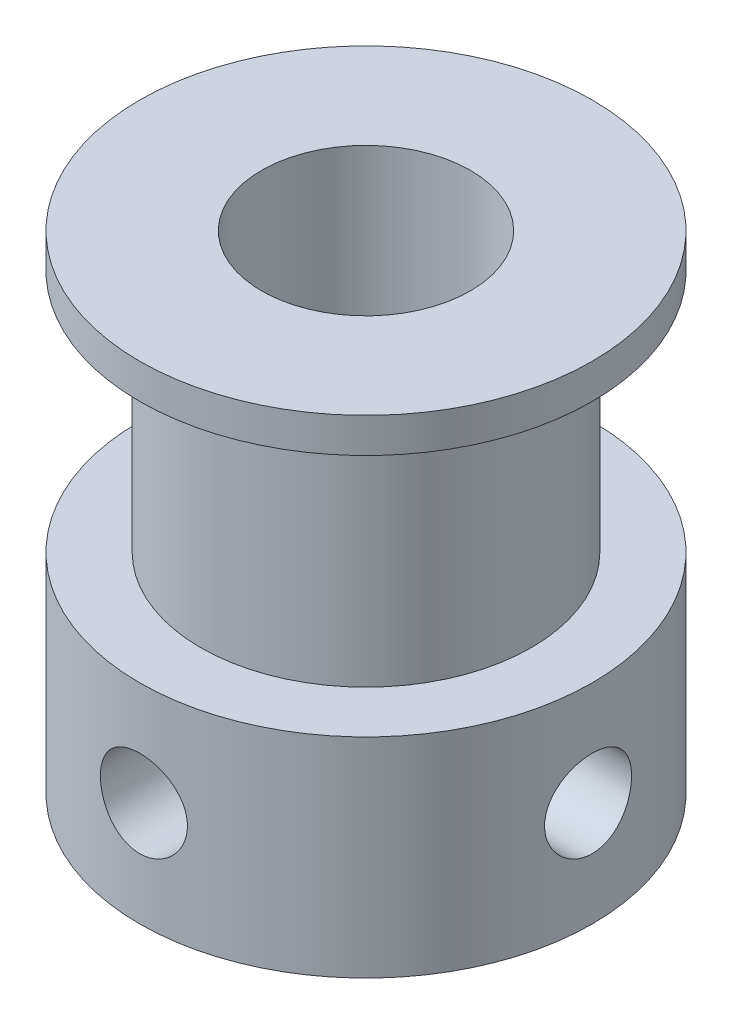
ISO-10303-21;
HEADER;
FILE_DESCRIPTION(('STEP AP214'),'2;1');
FILE_NAME('part.step','',(''),(''),'','','');
FILE_SCHEMA(('AUTOMOTIVE_DESIGN { 1 0 10303 214 1 1 1 1 }'));
ENDSEC;
DATA;
#1=APPLICATION_CONTEXT('core data for automotive mechanical design processes');
#2=APPLICATION_PROTOCOL_DEFINITION('international standard','automotive_design',2000,#1);
#3=PRODUCT_CONTEXT('',#1,'mechanical');
#4=PRODUCT('Part','Part','',(#3));
#5=PRODUCT_RELATED_PRODUCT_CATEGORY('part','',(#4));
#6=PRODUCT_DEFINITION_FORMATION('','',#4);
#7=PRODUCT_DEFINITION_CONTEXT('part definition',#1,'design');
#8=PRODUCT_DEFINITION('design','',#6,#7);
#9=PRODUCT_DEFINITION_SHAPE('','',#8);
#10=(LENGTH_UNIT() NAMED_UNIT(*) SI_UNIT(.MILLI.,.METRE.));
#11=(NAMED_UNIT(*) PLANE_ANGLE_UNIT() SI_UNIT($,.RADIAN.));
#12=(NAMED_UNIT(*) SI_UNIT($,.STERADIAN.) SOLID_ANGLE_UNIT());
#13=UNCERTAINTY_MEASURE_WITH_UNIT(LENGTH_MEASURE(1.E-05),#10,'distance_accuracy_value','');
#14=(GEOMETRIC_REPRESENTATION_CONTEXT(3) GLOBAL_UNCERTAINTY_ASSIGNED_CONTEXT((#13)) GLOBAL_UNIT_ASSIGNED_CONTEXT((#10,
#11,#12)) REPRESENTATION_CONTEXT('',''));
#15=CARTESIAN_POINT('',(0.,0.,0.));
#16=DIRECTION('',(0.,0.,1.));
#17=DIRECTION('',(1.,0.,0.));
#18=AXIS2_PLACEMENT_3D('',#15,#16,#17);
#19=CARTESIAN_POINT('',(0.,0.,0.));
#20=DIRECTION('',(0.,-1.,0.));
#21=DIRECTION('',(0.,0.,-1.));
#22=AXIS2_PLACEMENT_3D('',#19,#20,#21);
#23=CYLINDRICAL_SURFACE('',#22,3.);
#24=CARTESIAN_POINT('',(2.72717802865893,3.,1.24999999999999));
#25=CARTESIAN_POINT('',(2.72718519563219,3.06667189089685,1.24999259066567));
#26=CARTESIAN_POINT('',(2.729658595344,3.13345265682621,1.24463203881502));
#27=CARTESIAN_POINT('',(2.73923833650884,3.26508694205714,1.22339678947784));
#28=CARTESIAN_POINT('',(2.74635725824267,3.32993472667523,1.20749354003276));
#29=CARTESIAN_POINT('',(2.76426917574768,3.45556112969107,1.1658998841945));
#30=CARTESIAN_POINT('',(2.77504717562616,3.51635516371501,1.14024937431427));
#31=CARTESIAN_POINT('',(2.79904148565793,3.63275944957805,1.08000637754462));
#32=CARTESIAN_POINT('',(2.81225721880783,3.68837092343312,1.04541600591531));
#33=CARTESIAN_POINT('',(2.84055762619857,3.79632572497347,0.965973882676161));
#34=CARTESIAN_POINT('',(2.85570568079146,3.84830755874409,0.920653238184403));
#35=CARTESIAN_POINT('',(2.88564295372227,3.94420022249755,0.822021675745545));
#36=CARTESIAN_POINT('',(2.90043203180789,3.98810794061301,0.768707691374));
#37=CARTESIAN_POINT('',(2.92875537930613,4.06844953087927,0.652763393797344));
#38=CARTESIAN_POINT('',(2.94220739975291,4.10447662803234,0.589829293683655));
#39=CARTESIAN_POINT('',(2.96556519993426,4.1652760205056,0.45813202236235));
#40=CARTESIAN_POINT('',(2.97547255347157,4.19005331196421,0.389371454872121));
#41=CARTESIAN_POINT('',(2.99017521042367,4.22633945875673,0.251768498025164));
#42=CARTESIAN_POINT('',(2.99520971127466,4.23847169490204,0.183116576196079));
#43=CARTESIAN_POINT('',(3.00046828611204,4.25113764115985,0.0445791803650051));
#44=CARTESIAN_POINT('',(3.00069431131015,4.25167605588295,-0.0253057817645169));
#45=CARTESIAN_POINT('',(2.99645129133056,4.24146571906667,-0.159792780112568));
#46=CARTESIAN_POINT('',(2.99226714648664,4.23140189947427,-0.224457488607313));
#47=CARTESIAN_POINT('',(2.98006516750309,4.20144689736183,-0.351082893931455));
#48=CARTESIAN_POINT('',(2.97204705074577,4.18155499036983,-0.413043391054915));
#49=CARTESIAN_POINT('',(2.95279852414029,4.13227195910535,-0.533638118077524));
#50=CARTESIAN_POINT('',(2.94152097126085,4.10274053712917,-0.592207177074904));
#51=CARTESIAN_POINT('',(2.91685713989805,4.03515424329965,-0.703711767281961));
#52=CARTESIAN_POINT('',(2.90347011666255,3.99709635915501,-0.756645297756971));
#53=CARTESIAN_POINT('',(2.87481698777061,3.91041757959538,-0.85934091170792));
#54=CARTESIAN_POINT('',(2.8594849435601,3.86124120872099,-0.908616437316237));
#55=CARTESIAN_POINT('',(2.8293786068147,3.75528855929341,-0.998431414927664));
#56=CARTESIAN_POINT('',(2.8146045313137,3.6985093617079,-1.03896749582431));
#57=CARTESIAN_POINT('',(2.78681612355338,3.57660496333808,-1.11140189250063));
#58=CARTESIAN_POINT('',(2.77387558556714,3.51126679425672,-1.1429725335554));
#59=CARTESIAN_POINT('',(2.75209844221011,3.3755189550255,-1.19446432058391));
#60=CARTESIAN_POINT('',(2.74325890334594,3.30511295173045,-1.21439379627312));
#61=CARTESIAN_POINT('',(2.73141212519724,3.166103191086,-1.24080025168121));
#62=CARTESIAN_POINT('',(2.72806369197117,3.09767887774095,-1.24806614632865));
#63=CARTESIAN_POINT('',(2.72660286810642,2.9605215175885,-1.25125630518998));
#64=CARTESIAN_POINT('',(2.72848866599319,2.89178858580829,-1.24718449318148));
#65=CARTESIAN_POINT('',(2.73693131345749,2.76060161456955,-1.22853477565555));
#66=CARTESIAN_POINT('',(2.74318138016618,2.6980273132132,-1.21464618818048));
#67=CARTESIAN_POINT('',(2.75925630297447,2.57614870350213,-1.17767058564225));
#68=CARTESIAN_POINT('',(2.76908199460161,2.51684516316929,-1.15458142053124));
#69=CARTESIAN_POINT('',(2.79170797857,2.40038468964353,-1.09877520805186));
#70=CARTESIAN_POINT('',(2.80461662202282,2.34342502538968,-1.06569183306197));
#71=CARTESIAN_POINT('',(2.83180003740794,2.23559194750098,-0.991200784385964));
#72=CARTESIAN_POINT('',(2.84607539920583,2.18472118329814,-0.949789507875981));
#73=CARTESIAN_POINT('',(2.87578619784532,2.086199865116,-0.855844455715499));
#74=CARTESIAN_POINT('',(2.89122146708842,2.03914860004935,-0.802679661479732));
#75=CARTESIAN_POINT('',(2.92043361183923,1.95452770802067,-0.688851512553533));
#76=CARTESIAN_POINT('',(2.93421036577013,1.9169587759363,-0.628187608803651));
#77=CARTESIAN_POINT('',(2.9586425158565,1.85241012455643,-0.50065468080338));
#78=CARTESIAN_POINT('',(2.96928983138826,1.82545775871053,-0.433770169638502));
#79=CARTESIAN_POINT('',(2.98618173103366,1.78338320766558,-0.295858835154413));
#80=CARTESIAN_POINT('',(2.9924289351992,1.76825398177394,-0.224834504225192));
#81=CARTESIAN_POINT('',(2.9995153479751,1.7511418744797,-0.0860165335064087));
#82=CARTESIAN_POINT('',(3.00070204534225,1.74831400030304,-0.018344084793896));
#83=CARTESIAN_POINT('',(2.99849523480953,1.75361314129395,0.116486811714286));
#84=CARTESIAN_POINT('',(2.99510252984313,1.76173823601287,0.183645347541156));
#85=CARTESIAN_POINT('',(2.98430065981734,1.78810607215867,0.313086482449185));
#86=CARTESIAN_POINT('',(2.97703824209233,1.80597968046956,0.375457537843569));
#87=CARTESIAN_POINT('',(2.95929499847058,1.85093424720914,0.49629223050133));
#88=CARTESIAN_POINT('',(2.94881356124206,1.87801695466491,0.554755122985826));
#89=CARTESIAN_POINT('',(2.92505825398662,1.94198952921447,0.66902456547878));
#90=CARTESIAN_POINT('',(2.91167959188766,1.979267301424,0.72459165797668));
#91=CARTESIAN_POINT('',(2.88371561874231,2.0620071828719,0.828918675638779));
#92=CARTESIAN_POINT('',(2.86912986083797,2.10747233040676,0.87767606178604));
#93=CARTESIAN_POINT('',(2.83914845259141,2.20894482585441,0.970449787231577));
#94=CARTESIAN_POINT('',(2.82376522857896,2.26545901462113,1.01391775364847));
#95=CARTESIAN_POINT('',(2.79495552690186,2.3854587406802,1.09083332306674));
#96=CARTESIAN_POINT('',(2.78153014522558,2.44894814805815,1.12427532456754));
#97=CARTESIAN_POINT('',(2.75842557732643,2.58094383502276,1.17982766043577));
#98=CARTESIAN_POINT('',(2.74872654469865,2.64942115879321,1.20199823632853));
#99=CARTESIAN_POINT('',(2.73440803066668,2.78953957385067,1.234235564538));
#100=CARTESIAN_POINT('',(2.72977151604981,2.8611692072743,1.24434291521209));
#101=CARTESIAN_POINT('',(2.72744979732688,2.95535852426189,1.24940464923649));
#102=CARTESIAN_POINT('',(2.72717562860875,2.97767315738804,1.25000248121118));
#103=CARTESIAN_POINT('',(2.72717802865893,3.,1.24999999999999));
#104=B_SPLINE_CURVE_WITH_KNOTS('',3,(#24,#25,#26,#27,#28,#29,#30,#31,#32,#33,#34,#35,#36,#37,
#38,#39,#40,#41,#42,#43,#44,#45,#46,#47,#48,#49,#50,#51,#52,#53,#54,#55,#56,#57,#58,#59,#60,#61,
#62,#63,#64,#65,#66,#67,#68,#69,#70,#71,#72,#73,#74,#75,#76,#77,#78,#79,#80,#81,#82,#83,#84,#85,
#86,#87,#88,#89,#90,#91,#92,#93,#94,#95,#96,#97,#98,#99,#100,#101,#102,#103),.UNSPECIFIED.,.T.,
.F.,(4,2,2,2,2,2,2,2,2,2,2,2,2,2,2,2,2,2,2,2,2,2,2,2,2,2,2,2,2,2,2,2,2,2,2,2,2,2,2,4),(0.,
0.199951711985513,0.400447161842173,0.600130652152108,0.799766938550096,1.01066841430653,
1.2216510045991,1.44178476577923,1.6618206677489,1.87040605977951,2.07890680917929,
2.27471840245092,2.47054443201882,2.66935814640064,2.86824221022483,3.08114531844483,
3.29413040441365,3.5141154566672,3.73394290745567,3.93950778306306,4.14500152518447,
4.3373390106619,4.52972146913527,4.73025126818167,4.93086800795463,5.14781662735511,
5.36478114041864,5.58230105955592,5.79969134643005,6.0018863509405,6.20404590801911,
6.39903415036485,6.59405944632169,6.79789862829034,7.00181361048901,7.21960426908074,
7.43751638139185,7.65425125796861,7.87025464546159,7.93721375436702),.UNSPECIFIED.);
#105=CARTESIAN_POINT('',(2.72717802865893,3.,1.24999999999999));
#106=VERTEX_POINT('',#105);
#107=EDGE_CURVE('E83',#106,#106,#104,.T.);
#108=ORIENTED_EDGE('',*,*,#107,.F.);
#109=EDGE_LOOP('',(#108));
#110=FACE_BOUND('',#109,.T.);
#111=CARTESIAN_POINT('',(-1.25,3.,2.72717802865893));
#112=CARTESIAN_POINT('',(-1.24999259066567,3.06667189089685,2.72718519563219));
#113=CARTESIAN_POINT('',(-1.24463203881503,3.13345265682622,2.729658595344));
#114=CARTESIAN_POINT('',(-1.22339678947785,3.26508694205714,2.73923833650884));
#115=CARTESIAN_POINT('',(-1.20749354003276,3.32993472667524,2.74635725824267));
#116=CARTESIAN_POINT('',(-1.16589988419451,3.45556112969107,2.76426917574768));
#117=CARTESIAN_POINT('',(-1.14024937431428,3.51635516371502,2.77504717562616));
#118=CARTESIAN_POINT('',(-1.08000637754463,3.63275944957805,2.79904148565793));
#119=CARTESIAN_POINT('',(-1.04541600591531,3.68837092343312,2.81225721880783));
#120=CARTESIAN_POINT('',(-0.965973882676166,3.79632572497347,2.84055762619856));
#121=CARTESIAN_POINT('',(-0.920653238184408,3.84830755874409,2.85570568079146));
#122=CARTESIAN_POINT('',(-0.822021675745549,3.94420022249756,2.88564295372227));
#123=CARTESIAN_POINT('',(-0.768707691374004,3.98810794061301,2.90043203180789));
#124=CARTESIAN_POINT('',(-0.652763393797348,4.06844953087928,2.92875537930613));
#125=CARTESIAN_POINT('',(-0.589829293683658,4.10447662803235,2.94220739975291));
#126=CARTESIAN_POINT('',(-0.458132022362352,4.1652760205056,2.96556519993426));
#127=CARTESIAN_POINT('',(-0.389371454872124,4.19005331196422,2.97547255347157));
#128=CARTESIAN_POINT('',(-0.251768498025165,4.22633945875674,2.99017521042366));
#129=CARTESIAN_POINT('',(-0.18311657619608,4.23847169490205,2.99520971127466));
#130=CARTESIAN_POINT('',(-0.0445791803650058,4.25113764115986,3.00046828611204));
#131=CARTESIAN_POINT('',(0.0253057817645165,4.25167605588296,3.00069431131015));
#132=CARTESIAN_POINT('',(0.159792780112568,4.24146571906668,2.99645129133056));
#133=CARTESIAN_POINT('',(0.224457488607314,4.23140189947427,2.99226714648664));
#134=CARTESIAN_POINT('',(0.351082893931456,4.20144689736184,2.98006516750309));
#135=CARTESIAN_POINT('',(0.413043391054916,4.18155499036983,2.97204705074577));
#136=CARTESIAN_POINT('',(0.533638118077525,4.13227195910536,2.95279852414029));
#137=CARTESIAN_POINT('',(0.592207177074906,4.10274053712917,2.94152097126085));
#138=CARTESIAN_POINT('',(0.703711767281963,4.03515424329966,2.91685713989805));
#139=CARTESIAN_POINT('',(0.756645297756974,3.99709635915501,2.90347011666255));
#140=CARTESIAN_POINT('',(0.859340911707924,3.91041757959538,2.87481698777061));
#141=CARTESIAN_POINT('',(0.90861643731624,3.86124120872099,2.85948494356009));
#142=CARTESIAN_POINT('',(0.998431414927668,3.75528855929342,2.8293786068147));
#143=CARTESIAN_POINT('',(1.03896749582431,3.69850936170791,2.8146045313137));
#144=CARTESIAN_POINT('',(1.11140189250063,3.57660496333809,2.78681612355338));
#145=CARTESIAN_POINT('',(1.1429725335554,3.51126679425672,2.77387558556714));
#146=CARTESIAN_POINT('',(1.19446432058391,3.3755189550255,2.75209844221011));
#147=CARTESIAN_POINT('',(1.21439379627313,3.30511295173045,2.74325890334594));
#148=CARTESIAN_POINT('',(1.24080025168121,3.166103191086,2.73141212519723));
#149=CARTESIAN_POINT('',(1.24806614632866,3.09767887774095,2.72806369197117));
#150=CARTESIAN_POINT('',(1.25125630518999,2.9605215175885,2.72660286810642));
#151=CARTESIAN_POINT('',(1.24718449318149,2.89178858580829,2.72848866599319));
#152=CARTESIAN_POINT('',(1.22853477565556,2.76060161456955,2.73693131345749));
#153=CARTESIAN_POINT('',(1.21464618818048,2.6980273132132,2.74318138016617));
#154=CARTESIAN_POINT('',(1.17767058564225,2.57614870350213,2.75925630297447));
#155=CARTESIAN_POINT('',(1.15458142053125,2.51684516316929,2.76908199460161));
#156=CARTESIAN_POINT('',(1.09877520805186,2.40038468964353,2.79170797857));
#157=CARTESIAN_POINT('',(1.06569183306198,2.34342502538968,2.80461662202282));
#158=CARTESIAN_POINT('',(0.991200784385969,2.23559194750098,2.83180003740794));
#159=CARTESIAN_POINT('',(0.949789507875986,2.18472118329813,2.84607539920583));
#160=CARTESIAN_POINT('',(0.855844455715504,2.086199865116,2.87578619784532));
#161=CARTESIAN_POINT('',(0.802679661479737,2.03914860004934,2.89122146708841));
#162=CARTESIAN_POINT('',(0.688851512553538,1.95452770802067,2.92043361183923));
#163=CARTESIAN_POINT('',(0.628187608803656,1.9169587759363,2.93421036577013));
#164=CARTESIAN_POINT('',(0.500654680803384,1.85241012455643,2.9586425158565));
#165=CARTESIAN_POINT('',(0.433770169638506,1.82545775871052,2.96928983138826));
#166=CARTESIAN_POINT('',(0.295858835154416,1.78338320766557,2.98618173103366));
#167=CARTESIAN_POINT('',(0.224834504225195,1.76825398177393,2.9924289351992));
#168=CARTESIAN_POINT('',(0.0860165335064105,1.75114187447969,2.9995153479751));
#169=CARTESIAN_POINT('',(0.0183440847938972,1.74831400030304,3.00070204534225));
#170=CARTESIAN_POINT('',(-0.116486811714286,1.75361314129394,2.99849523480953));
#171=CARTESIAN_POINT('',(-0.183645347541155,1.76173823601287,2.99510252984313));
#172=CARTESIAN_POINT('',(-0.313086482449185,1.78810607215866,2.98430065981734));
#173=CARTESIAN_POINT('',(-0.375457537843569,1.80597968046955,2.97703824209233));
#174=CARTESIAN_POINT('',(-0.496292230501331,1.85093424720913,2.95929499847058));
#175=CARTESIAN_POINT('',(-0.554755122985827,1.87801695466491,2.94881356124206));
#176=CARTESIAN_POINT('',(-0.669024565478782,1.94198952921447,2.92505825398662));
#177=CARTESIAN_POINT('',(-0.724591657976682,1.97926730142399,2.91167959188766));
#178=CARTESIAN_POINT('',(-0.828918675638782,2.06200718287189,2.88371561874231));
#179=CARTESIAN_POINT('',(-0.877676061786042,2.10747233040675,2.86912986083797));
#180=CARTESIAN_POINT('',(-0.97044978723158,2.2089448258544,2.83914845259141));
#181=CARTESIAN_POINT('',(-1.01391775364847,2.26545901462112,2.82376522857896));
#182=CARTESIAN_POINT('',(-1.09083332306674,2.38545874068019,2.79495552690186));
#183=CARTESIAN_POINT('',(-1.12427532456755,2.44894814805814,2.78153014522558));
#184=CARTESIAN_POINT('',(-1.17982766043577,2.58094383502275,2.75842557732642));
#185=CARTESIAN_POINT('',(-1.20199823632854,2.64942115879321,2.74872654469865));
#186=CARTESIAN_POINT('',(-1.23423556453801,2.78953957385067,2.73440803066667));
#187=CARTESIAN_POINT('',(-1.2443429152121,2.8611692072743,2.7297715160498));
#188=CARTESIAN_POINT('',(-1.2494046492365,2.95535852426189,2.72744979732688));
#189=CARTESIAN_POINT('',(-1.25000248121118,2.97767315738804,2.72717562860874));
#190=CARTESIAN_POINT('',(-1.25,3.,2.72717802865893));
#191=B_SPLINE_CURVE_WITH_KNOTS('',3,(#111,#112,#113,#114,#115,#116,#117,#118,#119,#120,#121,
#122,#123,#124,#125,#126,#127,#128,#129,#130,#131,#132,#133,#134,#135,#136,#137,#138,#139,#140,
#141,#142,#143,#144,#145,#146,#147,#148,#149,#150,#151,#152,#153,#154,#155,#156,#157,#158,#159,
#160,#161,#162,#163,#164,#165,#166,#167,#168,#169,#170,#171,#172,#173,#174,#175,#176,#177,#178,
#179,#180,#181,#182,#183,#184,#185,#186,#187,#188,#189,#190),.UNSPECIFIED.,.T.,.F.,(4,2,2,2,2,2,
2,2,2,2,2,2,2,2,2,2,2,2,2,2,2,2,2,2,2,2,2,2,2,2,2,2,2,2,2,2,2,2,2,4),(0.,0.199951711985514,
0.400447161842175,0.600130652152112,0.799766938550099,1.01066841430654,1.2216510045991,
1.44178476577924,1.66182066774891,1.87040605977952,2.0789068091793,2.27471840245093,
2.47054443201883,2.66935814640065,2.86824221022484,3.08114531844484,3.29413040441366,
3.51411545666722,3.73394290745569,3.93950778306307,4.14500152518448,4.33733901066192,
4.5297214691353,4.73025126818169,4.93086800795465,5.14781662735514,5.36478114041866,
5.58230105955595,5.79969134643007,6.00188635094053,6.20404590801914,6.39903415036488,
6.59405944632173,6.79789862829037,7.00181361048904,7.21960426908077,7.43751638139189,
7.65425125796865,7.87025464546163,7.93721375436706),.UNSPECIFIED.);
#192=CARTESIAN_POINT('',(-1.25,3.,2.72717802865893));
#193=VERTEX_POINT('',#192);
#194=EDGE_CURVE('E75',#193,#193,#191,.T.);
#195=ORIENTED_EDGE('',*,*,#194,.F.);
#196=EDGE_LOOP('',(#195));
#197=FACE_BOUND('',#196,.T.);
#198=CARTESIAN_POINT('',(0.,0.,0.));
#199=DIRECTION('',(0.,-1.,0.));
#200=DIRECTION('',(0.,0.,-1.));
#201=AXIS2_PLACEMENT_3D('',#198,#199,#200);
#202=CIRCLE('',#201,3.);
#203=CARTESIAN_POINT('',(0.,0.,-3.));
#204=VERTEX_POINT('',#203);
#205=EDGE_CURVE('E50',#204,#204,#202,.T.);
#206=ORIENTED_EDGE('',*,*,#205,.T.);
#207=EDGE_LOOP('',(#206));
#208=FACE_BOUND('',#207,.T.);
#209=CARTESIAN_POINT('',(0.,14.,0.));
#210=DIRECTION('',(0.,-1.,0.));
#211=DIRECTION('',(0.,0.,-1.));
#212=AXIS2_PLACEMENT_3D('',#209,#210,#211);
#213=CIRCLE('',#212,3.);
#214=CARTESIAN_POINT('',(0.,14.,-3.));
#215=VERTEX_POINT('',#214);
#216=EDGE_CURVE('E82',#215,#215,#213,.T.);
#217=ORIENTED_EDGE('',*,*,#216,.F.);
#218=EDGE_LOOP('',(#217));
#219=FACE_BOUND('',#218,.T.);
#220=ADVANCED_FACE('F34',(#110,#197,#208,#219),#23,.F.);
#221=CARTESIAN_POINT('',(3.,0.,0.));
#222=DIRECTION('',(0.,-1.,0.));
#223=DIRECTION('',(0.,0.,-1.));
#224=AXIS2_PLACEMENT_3D('',#221,#222,#223);
#225=PLANE('',#224);
#226=CARTESIAN_POINT('',(0.,0.,0.));
#227=DIRECTION('',(0.,-1.,0.));
#228=DIRECTION('',(0.,0.,-1.));
#229=AXIS2_PLACEMENT_3D('',#226,#227,#228);
#230=CIRCLE('',#229,6.5);
#231=CARTESIAN_POINT('',(0.,0.,-6.5));
#232=VERTEX_POINT('',#231);
#233=EDGE_CURVE('E54',#232,#232,#230,.T.);
#234=ORIENTED_EDGE('',*,*,#233,.T.);
#235=EDGE_LOOP('',(#234));
#236=FACE_BOUND('',#235,.T.);
#237=ORIENTED_EDGE('',*,*,#205,.F.);
#238=EDGE_LOOP('',(#237));
#239=FACE_BOUND('',#238,.T.);
#240=ADVANCED_FACE('F106',(#236,#239),#225,.T.);
#241=CARTESIAN_POINT('',(0.,0.,0.));
#242=DIRECTION('',(0.,-1.,0.));
#243=DIRECTION('',(0.,0.,-1.));
#244=AXIS2_PLACEMENT_3D('',#241,#242,#243);
#245=CYLINDRICAL_SURFACE('',#244,6.5);
#246=CARTESIAN_POINT('',(6.5,1.75000000000001,0.));
#247=CARTESIAN_POINT('',(6.49999873054918,1.75000262060986,-0.0695263300903764));
#248=CARTESIAN_POINT('',(6.49887299034978,1.755820293649,-0.139086386536077));
#249=CARTESIAN_POINT('',(6.49449072478032,1.77892097243112,-0.276244066545679));
#250=CARTESIAN_POINT('',(6.49123244093525,1.79621344034302,-0.343840022447297));
#251=CARTESIAN_POINT('',(6.48294932466696,1.84171279024408,-0.475066268731183));
#252=CARTESIAN_POINT('',(6.47792612463065,1.86990958913683,-0.538700159856864));
#253=CARTESIAN_POINT('',(6.46666077439192,1.93638806396314,-0.660328619211788));
#254=CARTESIAN_POINT('',(6.46041871297687,1.97466900539309,-0.718323597744217));
#255=CARTESIAN_POINT('',(6.44731615012176,2.0607395828539,-0.827762164871105));
#256=CARTESIAN_POINT('',(6.44044947743084,2.10863141572556,-0.879124647683765));
#257=CARTESIAN_POINT('',(6.42691706808667,2.21234451859734,-0.973138343078078));
#258=CARTESIAN_POINT('',(6.42025134636388,2.26816637603829,-1.01578890972675));
#259=CARTESIAN_POINT('',(6.40781547009761,2.3867319976789,-1.0915083981031));
#260=CARTESIAN_POINT('',(6.40205326632547,2.44952971555017,-1.12449425725112));
#261=CARTESIAN_POINT('',(6.39216406280365,2.57990495501329,-1.17941610157593));
#262=CARTESIAN_POINT('',(6.38803691434868,2.64748204127121,-1.20135309167638));
#263=CARTESIAN_POINT('',(6.38194735063818,2.78462809585959,-1.23329305228568));
#264=CARTESIAN_POINT('',(6.37995924110286,2.85416288334854,-1.2434377939577));
#265=CARTESIAN_POINT('',(6.37829543879724,2.99397381845999,-1.2519454509238));
#266=CARTESIAN_POINT('',(6.3786195277321,3.06424989547179,-1.25030947843595));
#267=CARTESIAN_POINT('',(6.38152012920898,3.20251761158103,-1.23541697804276));
#268=CARTESIAN_POINT('',(6.38406529733108,3.27052742238238,-1.22232215325026));
#269=CARTESIAN_POINT('',(6.39107200195107,3.40336649155779,-1.18513854067888));
#270=CARTESIAN_POINT('',(6.39553362370363,3.46819560829362,-1.16104926380165));
#271=CARTESIAN_POINT('',(6.40590301761788,3.59330347190975,-1.10240382729655));
#272=CARTESIAN_POINT('',(6.41181970353635,3.653551055254,-1.06778282798613));
#273=CARTESIAN_POINT('',(6.42442673553149,3.76744248556928,-0.989102525446732));
#274=CARTESIAN_POINT('',(6.43111716402495,3.82108562779584,-0.945042216343227));
#275=CARTESIAN_POINT('',(6.44465411904849,3.9211792671104,-0.847864455663334));
#276=CARTESIAN_POINT('',(6.45150139326972,3.9674955950184,-0.79460880577996));
#277=CARTESIAN_POINT('',(6.46447860514488,4.05055775365026,-0.681013328076989));
#278=CARTESIAN_POINT('',(6.47060853487937,4.08730347872057,-0.620673422062235));
#279=CARTESIAN_POINT('',(6.48147374305158,4.15020302351982,-0.494478881244394));
#280=CARTESIAN_POINT('',(6.48620711303174,4.17634236730858,-0.428616856521531));
#281=CARTESIAN_POINT('',(6.49373123608211,4.21714871167345,-0.293325284598555));
#282=CARTESIAN_POINT('',(6.4965222064135,4.2318169953326,-0.223896137321167));
#283=CARTESIAN_POINT('',(6.4998170641524,4.24907688307678,-0.0845949575723073));
#284=CARTESIAN_POINT('',(6.50035574677271,4.25185223592052,-0.0147464889976585));
#285=CARTESIAN_POINT('',(6.49918164994221,4.24574111140167,0.124416318296412));
#286=CARTESIAN_POINT('',(6.497468987103,4.23685523804882,0.193730684493375));
#287=CARTESIAN_POINT('',(6.49200634359786,4.20782662800248,0.32927112129011));
#288=CARTESIAN_POINT('',(6.48827328656802,4.18777736078712,0.395517951862496));
#289=CARTESIAN_POINT('',(6.47918677244288,4.13709260993777,0.523709778000946));
#290=CARTESIAN_POINT('',(6.47383320094063,4.10645637885136,0.585654469459847));
#291=CARTESIAN_POINT('',(6.4620127326735,4.03506412841262,0.704264341336225));
#292=CARTESIAN_POINT('',(6.4555338112679,3.9941964542316,0.760861092631652));
#293=CARTESIAN_POINT('',(6.44221127589378,3.90365188825132,0.866459302715512));
#294=CARTESIAN_POINT('',(6.43536762602225,3.85397412808301,0.91546001190446));
#295=CARTESIAN_POINT('',(6.42197081919612,3.74638591930198,1.00517755082431));
#296=CARTESIAN_POINT('',(6.41542307578637,3.68836987485851,1.04576869619256));
#297=CARTESIAN_POINT('',(6.40347051879715,3.56623483786333,1.11662974416658));
#298=CARTESIAN_POINT('',(6.39806566143698,3.50211607922572,1.14690004216186));
#299=CARTESIAN_POINT('',(6.38905378658871,3.36990682052688,1.19608442093858));
#300=CARTESIAN_POINT('',(6.38543785792601,3.30183793326623,1.21505488797638));
#301=CARTESIAN_POINT('',(6.38039343660705,3.16340246339675,1.24127395271722));
#302=CARTESIAN_POINT('',(6.37896468278173,3.0930361561463,1.24852394995944));
#303=CARTESIAN_POINT('',(6.37847010253234,2.95326332203922,1.25104755843673));
#304=CARTESIAN_POINT('',(6.37936513521924,2.88386043851629,1.24651955106103));
#305=CARTESIAN_POINT('',(6.3833302398308,2.7468250277468,1.2260513326902));
#306=CARTESIAN_POINT('',(6.38640029712568,2.67919248859562,1.21011119845592));
#307=CARTESIAN_POINT('',(6.39435266298136,2.547731690079,1.16735673858749));
#308=CARTESIAN_POINT('',(6.39923121033494,2.48389585204118,1.14056497100193));
#309=CARTESIAN_POINT('',(6.4102533266987,2.36159381905454,1.07688985392763));
#310=CARTESIAN_POINT('',(6.41639699144119,2.30312803094554,1.04000574067458));
#311=CARTESIAN_POINT('',(6.42937795151368,2.19223421265769,0.956507819072137));
#312=CARTESIAN_POINT('',(6.43622463982555,2.13991565925893,0.909750049269221));
#313=CARTESIAN_POINT('',(6.44977101580728,2.04380131225286,0.808131192425038));
#314=CARTESIAN_POINT('',(6.45647066935191,2.00000747896596,0.753268246630369));
#315=CARTESIAN_POINT('',(6.46904328529454,1.92179349157222,0.636368128673312));
#316=CARTESIAN_POINT('',(6.47490774506217,1.88746681496544,0.574267467434705));
#317=CARTESIAN_POINT('',(6.48506595383496,1.82978960381797,0.445086129675204));
#318=CARTESIAN_POINT('',(6.48936115496814,1.80642891606555,0.378010126647425));
#319=CARTESIAN_POINT('',(6.49503671875109,1.77600770789271,0.25896178285277));
#320=CARTESIAN_POINT('',(6.49688729501668,1.76627175512384,0.207678719850836));
#321=CARTESIAN_POINT('',(6.49936939476943,1.75326700818149,0.104270079257341));
#322=CARTESIAN_POINT('',(6.50000095208405,1.749998034551,0.0521445250851628));
#323=CARTESIAN_POINT('',(6.5,1.75000000000001,0.));
#324=B_SPLINE_CURVE_WITH_KNOTS('',3,(#246,#247,#248,#249,#250,#251,#252,#253,#254,#255,#256,
#257,#258,#259,#260,#261,#262,#263,#264,#265,#266,#267,#268,#269,#270,#271,#272,#273,#274,#275,
#276,#277,#278,#279,#280,#281,#282,#283,#284,#285,#286,#287,#288,#289,#290,#291,#292,#293,#294,
#295,#296,#297,#298,#299,#300,#301,#302,#303,#304,#305,#306,#307,#308,#309,#310,#311,#312,#313,
#314,#315,#316,#317,#318,#319,#320,#321,#322,#323),.UNSPECIFIED.,.T.,.F.,(4,2,2,2,2,2,2,2,2,2,2,
2,2,2,2,2,2,2,2,2,2,2,2,2,2,2,2,2,2,2,2,2,2,2,2,2,2,2,4),(0.,0.208388270286284,
0.416948592398256,0.625316520786642,0.833669276372906,1.04436766202049,1.25508166394261,
1.4675568091212,1.68001262563573,1.88988689492413,2.09974135022728,2.30668132349719,
2.51363050358033,2.72188049935152,2.93015269776839,3.14188196787825,3.35361357524976,
3.5656331967002,3.77762909953163,3.98633752849763,4.19503514754153,4.4020110924708,
4.60900165313824,4.81835785477025,5.02773470314617,5.24004512383248,5.45234741003692,
5.66358123272485,5.87478983015676,6.0824640856177,6.29013694422219,6.49738029642492,
6.70463933664284,6.91515952159821,7.12572806013488,7.33830680136688,7.5506883296536,
7.7069832027341,7.86327373861125),.UNSPECIFIED.);
#325=CARTESIAN_POINT('',(6.5,1.75000000000001,0.));
#326=VERTEX_POINT('',#325);
#327=EDGE_CURVE('E10',#326,#326,#324,.T.);
#328=ORIENTED_EDGE('',*,*,#327,.F.);
#329=EDGE_LOOP('',(#328));
#330=FACE_BOUND('',#329,.T.);
#331=CARTESIAN_POINT('',(0.,1.75,6.5));
#332=CARTESIAN_POINT('',(0.0695263300903767,1.75000262060986,6.49999873054918));
#333=CARTESIAN_POINT('',(0.139086386536077,1.755820293649,6.49887299034978));
#334=CARTESIAN_POINT('',(0.27624406654568,1.77892097243111,6.49449072478032));
#335=CARTESIAN_POINT('',(0.343840022447299,1.79621344034301,6.49123244093525));
#336=CARTESIAN_POINT('',(0.475066268731185,1.84171279024407,6.48294932466696));
#337=CARTESIAN_POINT('',(0.538700159856867,1.86990958913682,6.47792612463065));
#338=CARTESIAN_POINT('',(0.660328619211791,1.93638806396314,6.46666077439192));
#339=CARTESIAN_POINT('',(0.718323597744221,1.97466900539309,6.46041871297687));
#340=CARTESIAN_POINT('',(0.827762164871109,2.06073958285389,6.44731615012176));
#341=CARTESIAN_POINT('',(0.879124647683768,2.10863141572555,6.44044947743084));
#342=CARTESIAN_POINT('',(0.973138343078081,2.21234451859733,6.42691706808667));
#343=CARTESIAN_POINT('',(1.01578890972676,2.26816637603829,6.42025134636388));
#344=CARTESIAN_POINT('',(1.09150839810311,2.3867319976789,6.4078154700976));
#345=CARTESIAN_POINT('',(1.12449425725113,2.44952971555017,6.40205326632547));
#346=CARTESIAN_POINT('',(1.17941610157593,2.57990495501328,6.39216406280365));
#347=CARTESIAN_POINT('',(1.20135309167639,2.64748204127121,6.38803691434868));
#348=CARTESIAN_POINT('',(1.23329305228569,2.78462809585959,6.38194735063818));
#349=CARTESIAN_POINT('',(1.24343779395771,2.85416288334854,6.37995924110286));
#350=CARTESIAN_POINT('',(1.2519454509238,2.99397381845999,6.37829543879724));
#351=CARTESIAN_POINT('',(1.25030947843596,3.06424989547179,6.3786195277321));
#352=CARTESIAN_POINT('',(1.23541697804277,3.20251761158103,6.38152012920898));
#353=CARTESIAN_POINT('',(1.22232215325027,3.27052742238238,6.38406529733108));
#354=CARTESIAN_POINT('',(1.18513854067889,3.40336649155779,6.39107200195106));
#355=CARTESIAN_POINT('',(1.16104926380165,3.46819560829363,6.39553362370363));
#356=CARTESIAN_POINT('',(1.10240382729656,3.59330347190975,6.40590301761788));
#357=CARTESIAN_POINT('',(1.06778282798614,3.653551055254,6.41181970353635));
#358=CARTESIAN_POINT('',(0.989102525446736,3.76744248556928,6.42442673553149));
#359=CARTESIAN_POINT('',(0.945042216343232,3.82108562779584,6.43111716402495));
#360=CARTESIAN_POINT('',(0.847864455663338,3.92117926711041,6.44465411904849));
#361=CARTESIAN_POINT('',(0.794608805779964,3.9674955950184,6.45150139326972));
#362=CARTESIAN_POINT('',(0.681013328076993,4.05055775365026,6.46447860514488));
#363=CARTESIAN_POINT('',(0.620673422062239,4.08730347872057,6.47060853487937));
#364=CARTESIAN_POINT('',(0.494478881244397,4.15020302351983,6.48147374305158));
#365=CARTESIAN_POINT('',(0.428616856521534,4.17634236730858,6.48620711303174));
#366=CARTESIAN_POINT('',(0.293325284598557,4.21714871167345,6.49373123608211));
#367=CARTESIAN_POINT('',(0.223896137321169,4.2318169953326,6.4965222064135));
#368=CARTESIAN_POINT('',(0.0845949575723078,4.24907688307679,6.4998170641524));
#369=CARTESIAN_POINT('',(0.0147464889976589,4.25185223592052,6.50035574677271));
#370=CARTESIAN_POINT('',(-0.124416318296412,4.24574111140168,6.49918164994221));
#371=CARTESIAN_POINT('',(-0.193730684493375,4.23685523804883,6.497468987103));
#372=CARTESIAN_POINT('',(-0.329271121290111,4.20782662800248,6.49200634359786));
#373=CARTESIAN_POINT('',(-0.395517951862496,4.18777736078712,6.48827328656802));
#374=CARTESIAN_POINT('',(-0.523709778000947,4.13709260993778,6.47918677244289));
#375=CARTESIAN_POINT('',(-0.585654469459849,4.10645637885136,6.47383320094063));
#376=CARTESIAN_POINT('',(-0.704264341336227,4.03506412841263,6.4620127326735));
#377=CARTESIAN_POINT('',(-0.760861092631654,3.9941964542316,6.4555338112679));
#378=CARTESIAN_POINT('',(-0.866459302715515,3.90365188825132,6.44221127589378));
#379=CARTESIAN_POINT('',(-0.915460011904463,3.85397412808302,6.43536762602225));
#380=CARTESIAN_POINT('',(-1.00517755082431,3.74638591930198,6.42197081919612));
#381=CARTESIAN_POINT('',(-1.04576869619256,3.68836987485852,6.41542307578637));
#382=CARTESIAN_POINT('',(-1.11662974416659,3.56623483786333,6.40347051879715));
#383=CARTESIAN_POINT('',(-1.14690004216186,3.50211607922572,6.39806566143697));
#384=CARTESIAN_POINT('',(-1.19608442093859,3.36990682052689,6.3890537865887));
#385=CARTESIAN_POINT('',(-1.21505488797639,3.30183793326623,6.385437857926));
#386=CARTESIAN_POINT('',(-1.24127395271723,3.16340246339675,6.38039343660705));
#387=CARTESIAN_POINT('',(-1.24852394995944,3.0930361561463,6.37896468278173));
#388=CARTESIAN_POINT('',(-1.25104755843674,2.95326332203922,6.37847010253234));
#389=CARTESIAN_POINT('',(-1.24651955106104,2.88386043851629,6.37936513521924));
#390=CARTESIAN_POINT('',(-1.2260513326902,2.7468250277468,6.38333023983079));
#391=CARTESIAN_POINT('',(-1.21011119845593,2.67919248859562,6.38640029712568));
#392=CARTESIAN_POINT('',(-1.16735673858749,2.547731690079,6.39435266298136));
#393=CARTESIAN_POINT('',(-1.14056497100194,2.48389585204118,6.39923121033494));
#394=CARTESIAN_POINT('',(-1.07688985392764,2.36159381905454,6.4102533266987));
#395=CARTESIAN_POINT('',(-1.04000574067459,2.30312803094554,6.41639699144119));
#396=CARTESIAN_POINT('',(-0.956507819072142,2.19223421265769,6.42937795151367));
#397=CARTESIAN_POINT('',(-0.909750049269226,2.13991565925893,6.43622463982555));
#398=CARTESIAN_POINT('',(-0.808131192425043,2.04380131225285,6.44977101580728));
#399=CARTESIAN_POINT('',(-0.753268246630374,2.00000747896596,6.45647066935191));
#400=CARTESIAN_POINT('',(-0.636368128673316,1.92179349157222,6.46904328529454));
#401=CARTESIAN_POINT('',(-0.574267467434709,1.88746681496543,6.47490774506217));
#402=CARTESIAN_POINT('',(-0.445086129675207,1.82978960381797,6.48506595383496));
#403=CARTESIAN_POINT('',(-0.378010126647428,1.80642891606555,6.48936115496814));
#404=CARTESIAN_POINT('',(-0.258961782852772,1.77600770789271,6.49503671875109));
#405=CARTESIAN_POINT('',(-0.207678719850838,1.76627175512383,6.49688729501668));
#406=CARTESIAN_POINT('',(-0.104270079257342,1.75326700818148,6.49936939476943));
#407=CARTESIAN_POINT('',(-0.0521445250851634,1.749998034551,6.50000095208405));
#408=CARTESIAN_POINT('',(0.,1.75,6.5));
#409=B_SPLINE_CURVE_WITH_KNOTS('',3,(#331,#332,#333,#334,#335,#336,#337,#338,#339,#340,#341,
#342,#343,#344,#345,#346,#347,#348,#349,#350,#351,#352,#353,#354,#355,#356,#357,#358,#359,#360,
#361,#362,#363,#364,#365,#366,#367,#368,#369,#370,#371,#372,#373,#374,#375,#376,#377,#378,#379,
#380,#381,#382,#383,#384,#385,#386,#387,#388,#389,#390,#391,#392,#393,#394,#395,#396,#397,#398,
#399,#400,#401,#402,#403,#404,#405,#406,#407,#408),.UNSPECIFIED.,.T.,.F.,(4,2,2,2,2,2,2,2,2,2,2,
2,2,2,2,2,2,2,2,2,2,2,2,2,2,2,2,2,2,2,2,2,2,2,2,2,2,2,4),(0.,0.208388270286285,
0.416948592398258,0.625316520786645,0.83366927637291,1.04436766202049,1.25508166394262,
1.4675568091212,1.68001262563574,1.88988689492414,2.09974135022729,2.3066813234972,
2.51363050358034,2.72188049935153,2.9301526977684,3.14188196787826,3.35361357524978,
3.56563319670022,3.77762909953165,3.98633752849764,4.19503514754155,4.40201109247082,
4.60900165313826,4.81835785477027,5.02773470314619,5.2400451238325,5.45234741003695,
5.66358123272487,5.87478983015678,6.08246408561772,6.29013694422222,6.49738029642495,
6.70463933664287,6.91515952159824,7.12572806013491,7.33830680136691,7.55068832965363,
7.70698320273413,7.86327373861129),.UNSPECIFIED.);
#410=CARTESIAN_POINT('',(0.,1.75,6.5));
#411=VERTEX_POINT('',#410);
#412=EDGE_CURVE('E46',#411,#411,#409,.T.);
#413=ORIENTED_EDGE('',*,*,#412,.F.);
#414=EDGE_LOOP('',(#413));
#415=FACE_BOUND('',#414,.T.);
#416=CARTESIAN_POINT('',(0.,6.,0.));
#417=DIRECTION('',(0.,-1.,0.));
#418=DIRECTION('',(0.,0.,-1.));
#419=AXIS2_PLACEMENT_3D('',#416,#417,#418);
#420=CIRCLE('',#419,6.5);
#421=CARTESIAN_POINT('',(0.,6.,-6.5));
#422=VERTEX_POINT('',#421);
#423=EDGE_CURVE('E101',#422,#422,#420,.T.);
#424=ORIENTED_EDGE('',*,*,#423,.T.);
#425=EDGE_LOOP('',(#424));
#426=FACE_BOUND('',#425,.T.);
#427=ORIENTED_EDGE('',*,*,#233,.F.);
#428=EDGE_LOOP('',(#427));
#429=FACE_BOUND('',#428,.T.);
#430=ADVANCED_FACE('F61',(#330,#415,#426,#429),#245,.T.);
#431=CARTESIAN_POINT('',(6.5,6.,0.));
#432=DIRECTION('',(0.,1.,0.));
#433=DIRECTION('',(0.,0.,1.));
#434=AXIS2_PLACEMENT_3D('',#431,#432,#433);
#435=PLANE('',#434);
#436=CARTESIAN_POINT('',(0.,6.,0.));
#437=DIRECTION('',(0.,-1.,0.));
#438=DIRECTION('',(0.,0.,-1.));
#439=AXIS2_PLACEMENT_3D('',#436,#437,#438);
#440=CIRCLE('',#439,4.75);
#441=CARTESIAN_POINT('',(0.,6.,-4.75));
#442=VERTEX_POINT('',#441);
#443=EDGE_CURVE('E98',#442,#442,#440,.T.);
#444=ORIENTED_EDGE('',*,*,#443,.T.);
#445=EDGE_LOOP('',(#444));
#446=FACE_BOUND('',#445,.T.);
#447=ORIENTED_EDGE('',*,*,#423,.F.);
#448=EDGE_LOOP('',(#447));
#449=FACE_BOUND('',#448,.T.);
#450=ADVANCED_FACE('F110',(#446,#449),#435,.T.);
#451=CARTESIAN_POINT('',(0.,0.,0.));
#452=DIRECTION('',(0.,-1.,0.));
#453=DIRECTION('',(0.,0.,-1.));
#454=AXIS2_PLACEMENT_3D('',#451,#452,#453);
#455=CYLINDRICAL_SURFACE('',#454,4.75);
#456=CARTESIAN_POINT('',(0.,13.,0.));
#457=DIRECTION('',(0.,-1.,0.));
#458=DIRECTION('',(0.,0.,-1.));
#459=AXIS2_PLACEMENT_3D('',#456,#457,#458);
#460=CIRCLE('',#459,4.75);
#461=CARTESIAN_POINT('',(0.,13.,-4.75));
#462=VERTEX_POINT('',#461);
#463=EDGE_CURVE('E95',#462,#462,#460,.T.);
#464=ORIENTED_EDGE('',*,*,#463,.T.);
#465=EDGE_LOOP('',(#464));
#466=FACE_BOUND('',#465,.T.);
#467=ORIENTED_EDGE('',*,*,#443,.F.);
#468=EDGE_LOOP('',(#467));
#469=FACE_BOUND('',#468,.T.);
#470=ADVANCED_FACE('F116',(#466,#469),#455,.T.);
#471=CARTESIAN_POINT('',(4.75,13.,0.));
#472=DIRECTION('',(0.,-1.,0.));
#473=DIRECTION('',(0.,0.,-1.));
#474=AXIS2_PLACEMENT_3D('',#471,#472,#473);
#475=PLANE('',#474);
#476=CARTESIAN_POINT('',(0.,13.,0.));
#477=DIRECTION('',(0.,-1.,0.));
#478=DIRECTION('',(0.,0.,-1.));
#479=AXIS2_PLACEMENT_3D('',#476,#477,#478);
#480=CIRCLE('',#479,6.5);
#481=CARTESIAN_POINT('',(0.,13.,-6.5));
#482=VERTEX_POINT('',#481);
#483=EDGE_CURVE('E92',#482,#482,#480,.T.);
#484=ORIENTED_EDGE('',*,*,#483,.T.);
#485=EDGE_LOOP('',(#484));
#486=FACE_BOUND('',#485,.T.);
#487=ORIENTED_EDGE('',*,*,#463,.F.);
#488=EDGE_LOOP('',(#487));
#489=FACE_BOUND('',#488,.T.);
#490=ADVANCED_FACE('F139',(#486,#489),#475,.T.);
#491=CARTESIAN_POINT('',(0.,0.,0.));
#492=DIRECTION('',(0.,-1.,0.));
#493=DIRECTION('',(0.,0.,-1.));
#494=AXIS2_PLACEMENT_3D('',#491,#492,#493);
#495=CYLINDRICAL_SURFACE('',#494,6.5);
#496=CARTESIAN_POINT('',(0.,14.,0.));
#497=DIRECTION('',(0.,-1.,0.));
#498=DIRECTION('',(0.,0.,-1.));
#499=AXIS2_PLACEMENT_3D('',#496,#497,#498);
#500=CIRCLE('',#499,6.5);
#501=CARTESIAN_POINT('',(0.,14.,-6.5));
#502=VERTEX_POINT('',#501);
#503=EDGE_CURVE('E89',#502,#502,#500,.T.);
#504=ORIENTED_EDGE('',*,*,#503,.T.);
#505=EDGE_LOOP('',(#504));
#506=FACE_BOUND('',#505,.T.);
#507=ORIENTED_EDGE('',*,*,#483,.F.);
#508=EDGE_LOOP('',(#507));
#509=FACE_BOUND('',#508,.T.);
#510=ADVANCED_FACE('F134',(#506,#509),#495,.T.);
#511=CARTESIAN_POINT('',(6.5,14.,0.));
#512=DIRECTION('',(0.,1.,0.));
#513=DIRECTION('',(0.,0.,1.));
#514=AXIS2_PLACEMENT_3D('',#511,#512,#513);
#515=PLANE('',#514);
#516=ORIENTED_EDGE('',*,*,#216,.T.);
#517=EDGE_LOOP('',(#516));
#518=FACE_BOUND('',#517,.T.);
#519=ORIENTED_EDGE('',*,*,#503,.F.);
#520=EDGE_LOOP('',(#519));
#521=FACE_BOUND('',#520,.T.);
#522=ADVANCED_FACE('F69',(#518,#521),#515,.T.);
#523=CARTESIAN_POINT('',(0.,3.,0.));
#524=DIRECTION('',(0.,0.,-1.));
#525=DIRECTION('',(-1.,0.,0.));
#526=AXIS2_PLACEMENT_3D('',#523,#524,#525);
#527=CYLINDRICAL_SURFACE('',#526,1.25);
#528=ORIENTED_EDGE('',*,*,#194,.T.);
#529=EDGE_LOOP('',(#528));
#530=FACE_BOUND('',#529,.T.);
#531=ORIENTED_EDGE('',*,*,#412,.T.);
#532=EDGE_LOOP('',(#531));
#533=FACE_BOUND('',#532,.T.);
#534=ADVANCED_FACE('F64',(#530,#533),#527,.F.);
#535=CARTESIAN_POINT('',(0.,3.,0.));
#536=DIRECTION('',(-1.,0.,0.));
#537=DIRECTION('',(0.,0.,1.));
#538=AXIS2_PLACEMENT_3D('',#535,#536,#537);
#539=CYLINDRICAL_SURFACE('',#538,1.24999999999999);
#540=ORIENTED_EDGE('',*,*,#107,.T.);
#541=EDGE_LOOP('',(#540));
#542=FACE_BOUND('',#541,.T.);
#543=ORIENTED_EDGE('',*,*,#327,.T.);
#544=EDGE_LOOP('',(#543));
#545=FACE_BOUND('',#544,.T.);
#546=ADVANCED_FACE('F68',(#542,#545),#539,.F.);
#547=CLOSED_SHELL('',(#220,#240,#430,#450,#470,#490,#510,#522,#534,#546));
#548=MANIFOLD_SOLID_BREP('B2',#547);
#549=ADVANCED_BREP_SHAPE_REPRESENTATION('',(#18,#548),#14);
#550=SHAPE_DEFINITION_REPRESENTATION(#9,#549);
ENDSEC;
END-ISO-10303-21;
